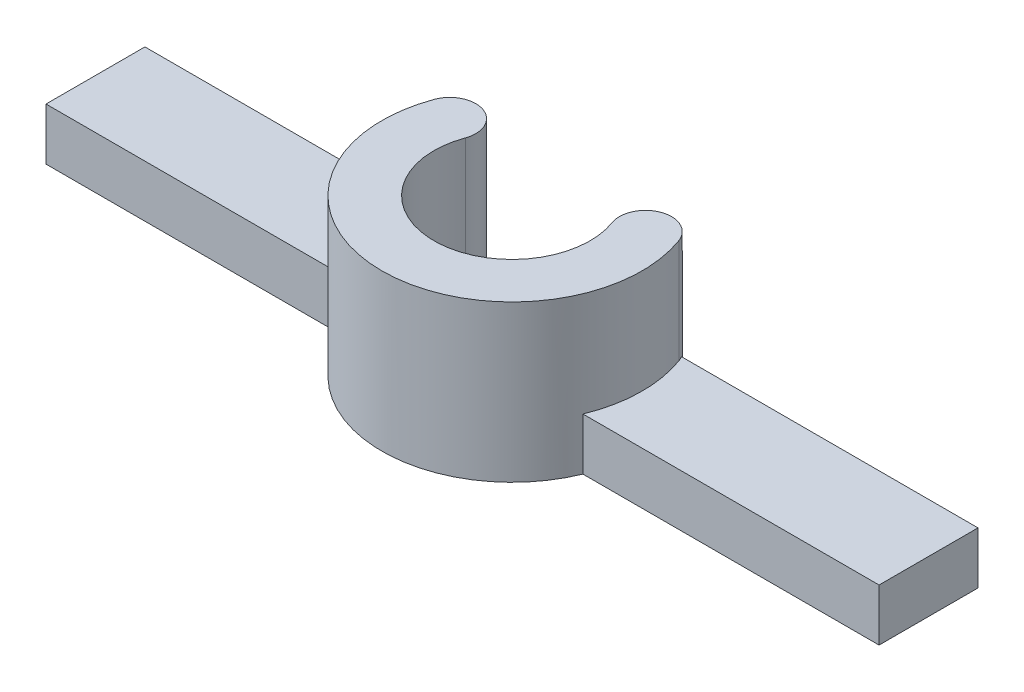
ISO-10303-21;
HEADER;
FILE_DESCRIPTION(('STEP AP214'),'2;1');
FILE_NAME('part.step','',(''),(''),'','','');
FILE_SCHEMA(('AUTOMOTIVE_DESIGN { 1 0 10303 214 1 1 1 1 }'));
ENDSEC;
DATA;
#1=APPLICATION_CONTEXT('core data for automotive mechanical design processes');
#2=APPLICATION_PROTOCOL_DEFINITION('international standard','automotive_design',2000,#1);
#3=PRODUCT_CONTEXT('',#1,'mechanical');
#4=PRODUCT('Part','Part','',(#3));
#5=PRODUCT_RELATED_PRODUCT_CATEGORY('part','',(#4));
#6=PRODUCT_DEFINITION_FORMATION('','',#4);
#7=PRODUCT_DEFINITION_CONTEXT('part definition',#1,'design');
#8=PRODUCT_DEFINITION('design','',#6,#7);
#9=PRODUCT_DEFINITION_SHAPE('','',#8);
#10=(LENGTH_UNIT() NAMED_UNIT(*) SI_UNIT(.MILLI.,.METRE.));
#11=(NAMED_UNIT(*) PLANE_ANGLE_UNIT() SI_UNIT($,.RADIAN.));
#12=(NAMED_UNIT(*) SI_UNIT($,.STERADIAN.) SOLID_ANGLE_UNIT());
#13=UNCERTAINTY_MEASURE_WITH_UNIT(LENGTH_MEASURE(1.E-05),#10,'distance_accuracy_value','');
#14=(GEOMETRIC_REPRESENTATION_CONTEXT(3) GLOBAL_UNCERTAINTY_ASSIGNED_CONTEXT((#13)) GLOBAL_UNIT_ASSIGNED_CONTEXT((#10,
#11,#12)) REPRESENTATION_CONTEXT('',''));
#15=CARTESIAN_POINT('',(0.,0.,0.));
#16=DIRECTION('',(0.,0.,1.));
#17=DIRECTION('',(1.,0.,0.));
#18=AXIS2_PLACEMENT_3D('',#15,#16,#17);
#19=CARTESIAN_POINT('',(3.75877048314363,6.,-1.36808057330268));
#20=DIRECTION('',(0.,-1.,0.));
#21=DIRECTION('',(0.,0.,-1.));
#22=AXIS2_PLACEMENT_3D('',#19,#20,#21);
#23=CYLINDRICAL_SURFACE('',#22,1.);
#24=DIRECTION('',(0.,-1.,0.));
#25=VECTOR('',#24,1.);
#26=CARTESIAN_POINT('',(4.60556545449266,6.,-1.9));
#27=LINE('',#26,#25);
#28=CARTESIAN_POINT('',(4.60556545449266,0.,-1.9));
#29=VERTEX_POINT('',#28);
#30=CARTESIAN_POINT('',(4.60556545449266,2.,-1.9));
#31=VERTEX_POINT('',#30);
#32=EDGE_CURVE('E148',#29,#31,#27,.F.);
#33=ORIENTED_EDGE('',*,*,#32,.F.);
#34=CARTESIAN_POINT('',(3.75877048314363,0.,-1.36808057330268));
#35=DIRECTION('',(0.,1.,0.));
#36=DIRECTION('',(0.,0.,1.));
#37=AXIS2_PLACEMENT_3D('',#34,#35,#36);
#38=CIRCLE('',#37,1.);
#39=CARTESIAN_POINT('',(2.81907786235773,0.,-1.02606042997701));
#40=VERTEX_POINT('',#39);
#41=EDGE_CURVE('E241',#29,#40,#38,.T.);
#42=ORIENTED_EDGE('',*,*,#41,.T.);
#43=DIRECTION('',(0.,-1.,0.));
#44=VECTOR('',#43,1.);
#45=CARTESIAN_POINT('',(2.81907786235773,6.,-1.02606042997701));
#46=LINE('',#45,#44);
#47=CARTESIAN_POINT('',(2.81907786235773,6.,-1.02606042997701));
#48=VERTEX_POINT('',#47);
#49=EDGE_CURVE('E250',#48,#40,#46,.T.);
#50=ORIENTED_EDGE('',*,*,#49,.F.);
#51=CARTESIAN_POINT('',(3.75877048314363,6.,-1.36808057330268));
#52=DIRECTION('',(0.,1.,0.));
#53=DIRECTION('',(0.,0.,1.));
#54=AXIS2_PLACEMENT_3D('',#51,#52,#53);
#55=CIRCLE('',#54,1.);
#56=CARTESIAN_POINT('',(4.69846310392954,6.,-1.71010071662835));
#57=VERTEX_POINT('',#56);
#58=EDGE_CURVE('E228',#57,#48,#55,.T.);
#59=ORIENTED_EDGE('',*,*,#58,.F.);
#60=DIRECTION('',(0.,-1.,0.));
#61=VECTOR('',#60,1.);
#62=CARTESIAN_POINT('',(4.69846310392954,6.,-1.71010071662835));
#63=LINE('',#62,#61);
#64=CARTESIAN_POINT('',(4.69846310392954,2.,-1.71010071662835));
#65=VERTEX_POINT('',#64);
#66=EDGE_CURVE('E254',#57,#65,#63,.T.);
#67=ORIENTED_EDGE('',*,*,#66,.T.);
#68=CARTESIAN_POINT('',(3.75877048314363,2.,-1.36808057330268));
#69=DIRECTION('',(0.,1.,0.));
#70=DIRECTION('',(0.,0.,1.));
#71=AXIS2_PLACEMENT_3D('',#68,#69,#70);
#72=CIRCLE('',#71,1.);
#73=EDGE_CURVE('E11',#65,#31,#72,.T.);
#74=ORIENTED_EDGE('',*,*,#73,.T.);
#75=EDGE_LOOP('',(#33,#42,#50,#59,#67,#74));
#76=FACE_BOUND('',#75,.T.);
#77=ADVANCED_FACE('F41',(#76),#23,.T.);
#78=CARTESIAN_POINT('',(0.,6.,0.));
#79=DIRECTION('',(0.,-1.,0.));
#80=DIRECTION('',(0.,0.,-1.));
#81=AXIS2_PLACEMENT_3D('',#78,#79,#80);
#82=CYLINDRICAL_SURFACE('',#81,5.);
#83=CARTESIAN_POINT('',(0.,0.,0.));
#84=DIRECTION('',(0.,1.,0.));
#85=DIRECTION('',(0.,0.,1.));
#86=AXIS2_PLACEMENT_3D('',#83,#84,#85);
#87=CIRCLE('',#86,5.);
#88=CARTESIAN_POINT('',(-4.62493243193887,0.,1.9));
#89=VERTEX_POINT('',#88);
#90=CARTESIAN_POINT('',(4.62493243193887,0.,1.9));
#91=VERTEX_POINT('',#90);
#92=EDGE_CURVE('E238',#89,#91,#87,.T.);
#93=ORIENTED_EDGE('',*,*,#92,.T.);
#94=DIRECTION('',(0.,-1.,0.));
#95=VECTOR('',#94,1.);
#96=CARTESIAN_POINT('',(4.62493243193887,6.,1.9));
#97=LINE('',#96,#95);
#98=CARTESIAN_POINT('',(4.62493243193887,2.,1.9));
#99=VERTEX_POINT('',#98);
#100=EDGE_CURVE('E57',#91,#99,#97,.F.);
#101=ORIENTED_EDGE('',*,*,#100,.T.);
#102=CARTESIAN_POINT('',(0.,2.,0.));
#103=DIRECTION('',(0.,1.,0.));
#104=DIRECTION('',(0.,0.,1.));
#105=AXIS2_PLACEMENT_3D('',#102,#103,#104);
#106=CIRCLE('',#105,5.);
#107=EDGE_CURVE('E175',#99,#65,#106,.T.);
#108=ORIENTED_EDGE('',*,*,#107,.T.);
#109=ORIENTED_EDGE('',*,*,#66,.F.);
#110=CARTESIAN_POINT('',(0.,6.,0.));
#111=DIRECTION('',(0.,1.,0.));
#112=DIRECTION('',(0.,0.,1.));
#113=AXIS2_PLACEMENT_3D('',#110,#111,#112);
#114=CIRCLE('',#113,5.);
#115=CARTESIAN_POINT('',(-4.69846310392954,6.,-1.71010071662835));
#116=VERTEX_POINT('',#115);
#117=EDGE_CURVE('E224',#116,#57,#114,.T.);
#118=ORIENTED_EDGE('',*,*,#117,.F.);
#119=DIRECTION('',(0.,-1.,0.));
#120=VECTOR('',#119,1.);
#121=CARTESIAN_POINT('',(-4.69846310392954,6.,-1.71010071662835));
#122=LINE('',#121,#120);
#123=CARTESIAN_POINT('',(-4.69846310392954,2.,-1.71010071662835));
#124=VERTEX_POINT('',#123);
#125=EDGE_CURVE('E257',#116,#124,#122,.T.);
#126=ORIENTED_EDGE('',*,*,#125,.T.);
#127=CARTESIAN_POINT('',(0.,2.,0.));
#128=DIRECTION('',(0.,1.,0.));
#129=DIRECTION('',(0.,0.,1.));
#130=AXIS2_PLACEMENT_3D('',#127,#128,#129);
#131=CIRCLE('',#130,5.);
#132=CARTESIAN_POINT('',(-4.62493243193887,2.,1.9));
#133=VERTEX_POINT('',#132);
#134=EDGE_CURVE('E50',#124,#133,#131,.T.);
#135=ORIENTED_EDGE('',*,*,#134,.T.);
#136=DIRECTION('',(0.,-1.,0.));
#137=VECTOR('',#136,1.);
#138=CARTESIAN_POINT('',(-4.62493243193887,6.,1.9));
#139=LINE('',#138,#137);
#140=EDGE_CURVE('E207',#89,#133,#139,.F.);
#141=ORIENTED_EDGE('',*,*,#140,.F.);
#142=EDGE_LOOP('',(#93,#101,#108,#109,#118,#126,#135,#141));
#143=FACE_BOUND('',#142,.T.);
#144=ADVANCED_FACE('F263',(#143),#82,.T.);
#145=CARTESIAN_POINT('',(-3.75877048314363,6.,-1.36808057330268));
#146=DIRECTION('',(0.,-1.,0.));
#147=DIRECTION('',(0.,0.,-1.));
#148=AXIS2_PLACEMENT_3D('',#145,#146,#147);
#149=CYLINDRICAL_SURFACE('',#148,1.);
#150=DIRECTION('',(0.,-1.,0.));
#151=VECTOR('',#150,1.);
#152=CARTESIAN_POINT('',(-4.60556545449266,6.,-1.9));
#153=LINE('',#152,#151);
#154=CARTESIAN_POINT('',(-4.60556545449266,2.,-1.9));
#155=VERTEX_POINT('',#154);
#156=CARTESIAN_POINT('',(-4.60556545449266,0.,-1.9));
#157=VERTEX_POINT('',#156);
#158=EDGE_CURVE('E211',#155,#157,#153,.T.);
#159=ORIENTED_EDGE('',*,*,#158,.F.);
#160=CARTESIAN_POINT('',(-3.75877048314363,2.,-1.36808057330268));
#161=DIRECTION('',(0.,1.,0.));
#162=DIRECTION('',(0.,0.,1.));
#163=AXIS2_PLACEMENT_3D('',#160,#161,#162);
#164=CIRCLE('',#163,1.);
#165=EDGE_CURVE('E215',#124,#155,#164,.F.);
#166=ORIENTED_EDGE('',*,*,#165,.F.);
#167=ORIENTED_EDGE('',*,*,#125,.F.);
#168=CARTESIAN_POINT('',(-3.75877048314363,6.,-1.36808057330268));
#169=DIRECTION('',(0.,1.,0.));
#170=DIRECTION('',(0.,0.,1.));
#171=AXIS2_PLACEMENT_3D('',#168,#169,#170);
#172=CIRCLE('',#171,1.);
#173=CARTESIAN_POINT('',(-2.81907786235773,6.,-1.02606042997701));
#174=VERTEX_POINT('',#173);
#175=EDGE_CURVE('E220',#116,#174,#172,.F.);
#176=ORIENTED_EDGE('',*,*,#175,.T.);
#177=DIRECTION('',(0.,-1.,0.));
#178=VECTOR('',#177,1.);
#179=CARTESIAN_POINT('',(-2.81907786235773,6.,-1.02606042997701));
#180=LINE('',#179,#178);
#181=CARTESIAN_POINT('',(-2.81907786235773,0.,-1.02606042997701));
#182=VERTEX_POINT('',#181);
#183=EDGE_CURVE('E235',#174,#182,#180,.T.);
#184=ORIENTED_EDGE('',*,*,#183,.T.);
#185=CARTESIAN_POINT('',(-3.75877048314363,0.,-1.36808057330268));
#186=DIRECTION('',(0.,1.,0.));
#187=DIRECTION('',(0.,0.,1.));
#188=AXIS2_PLACEMENT_3D('',#185,#186,#187);
#189=CIRCLE('',#188,1.);
#190=EDGE_CURVE('E219',#157,#182,#189,.F.);
#191=ORIENTED_EDGE('',*,*,#190,.F.);
#192=EDGE_LOOP('',(#159,#166,#167,#176,#184,#191));
#193=FACE_BOUND('',#192,.T.);
#194=ADVANCED_FACE('F43',(#193),#149,.T.);
#195=CARTESIAN_POINT('',(0.,6.,0.));
#196=DIRECTION('',(0.,-1.,0.));
#197=DIRECTION('',(0.,0.,-1.));
#198=AXIS2_PLACEMENT_3D('',#195,#196,#197);
#199=CYLINDRICAL_SURFACE('',#198,3.);
#200=CARTESIAN_POINT('',(0.,0.,0.));
#201=DIRECTION('',(0.,1.,0.));
#202=DIRECTION('',(0.,0.,1.));
#203=AXIS2_PLACEMENT_3D('',#200,#201,#202);
#204=CIRCLE('',#203,3.);
#205=EDGE_CURVE('E225',#182,#40,#204,.T.);
#206=ORIENTED_EDGE('',*,*,#205,.F.);
#207=ORIENTED_EDGE('',*,*,#183,.F.);
#208=CARTESIAN_POINT('',(0.,6.,0.));
#209=DIRECTION('',(0.,1.,0.));
#210=DIRECTION('',(0.,0.,1.));
#211=AXIS2_PLACEMENT_3D('',#208,#209,#210);
#212=CIRCLE('',#211,3.);
#213=EDGE_CURVE('E231',#174,#48,#212,.T.);
#214=ORIENTED_EDGE('',*,*,#213,.T.);
#215=ORIENTED_EDGE('',*,*,#49,.T.);
#216=EDGE_LOOP('',(#206,#207,#214,#215));
#217=FACE_BOUND('',#216,.T.);
#218=ADVANCED_FACE('F291',(#217),#199,.F.);
#219=CARTESIAN_POINT('',(0.,6.,0.));
#220=DIRECTION('',(0.,1.,0.));
#221=DIRECTION('',(0.,0.,1.));
#222=AXIS2_PLACEMENT_3D('',#219,#220,#221);
#223=PLANE('',#222);
#224=ORIENTED_EDGE('',*,*,#175,.F.);
#225=ORIENTED_EDGE('',*,*,#117,.T.);
#226=ORIENTED_EDGE('',*,*,#58,.T.);
#227=ORIENTED_EDGE('',*,*,#213,.F.);
#228=EDGE_LOOP('',(#224,#225,#226,#227));
#229=FACE_BOUND('',#228,.T.);
#230=ADVANCED_FACE('F294',(#229),#223,.T.);
#231=CARTESIAN_POINT('',(0.,0.,0.));
#232=DIRECTION('',(0.,1.,0.));
#233=DIRECTION('',(0.,0.,1.));
#234=AXIS2_PLACEMENT_3D('',#231,#232,#233);
#235=PLANE('',#234);
#236=ORIENTED_EDGE('',*,*,#41,.F.);
#237=DIRECTION('',(-1.,0.,0.));
#238=VECTOR('',#237,1.);
#239=CARTESIAN_POINT('',(0.,0.,-1.9));
#240=LINE('',#239,#238);
#241=CARTESIAN_POINT('',(16.,0.,-1.9));
#242=VERTEX_POINT('',#241);
#243=EDGE_CURVE('E160',#242,#29,#240,.T.);
#244=ORIENTED_EDGE('',*,*,#243,.F.);
#245=DIRECTION('',(0.,0.,1.));
#246=VECTOR('',#245,1.);
#247=CARTESIAN_POINT('',(16.,0.,0.));
#248=LINE('',#247,#246);
#249=CARTESIAN_POINT('',(16.,0.,1.9));
#250=VERTEX_POINT('',#249);
#251=EDGE_CURVE('E138',#242,#250,#248,.T.);
#252=ORIENTED_EDGE('',*,*,#251,.T.);
#253=DIRECTION('',(-1.,0.,0.));
#254=VECTOR('',#253,1.);
#255=CARTESIAN_POINT('',(0.,0.,1.9));
#256=LINE('',#255,#254);
#257=EDGE_CURVE('E156',#250,#91,#256,.T.);
#258=ORIENTED_EDGE('',*,*,#257,.T.);
#259=ORIENTED_EDGE('',*,*,#92,.F.);
#260=DIRECTION('',(1.,0.,0.));
#261=VECTOR('',#260,1.);
#262=CARTESIAN_POINT('',(0.,0.,1.9));
#263=LINE('',#262,#261);
#264=CARTESIAN_POINT('',(-16.,0.,1.9));
#265=VERTEX_POINT('',#264);
#266=EDGE_CURVE('E184',#265,#89,#263,.T.);
#267=ORIENTED_EDGE('',*,*,#266,.F.);
#268=DIRECTION('',(0.,0.,1.));
#269=VECTOR('',#268,1.);
#270=CARTESIAN_POINT('',(-16.,0.,0.));
#271=LINE('',#270,#269);
#272=CARTESIAN_POINT('',(-16.,0.,-1.9));
#273=VERTEX_POINT('',#272);
#274=EDGE_CURVE('E195',#273,#265,#271,.T.);
#275=ORIENTED_EDGE('',*,*,#274,.F.);
#276=DIRECTION('',(1.,0.,0.));
#277=VECTOR('',#276,1.);
#278=CARTESIAN_POINT('',(0.,0.,-1.9));
#279=LINE('',#278,#277);
#280=EDGE_CURVE('E178',#273,#157,#279,.T.);
#281=ORIENTED_EDGE('',*,*,#280,.T.);
#282=ORIENTED_EDGE('',*,*,#190,.T.);
#283=ORIENTED_EDGE('',*,*,#205,.T.);
#284=EDGE_LOOP('',(#236,#244,#252,#258,#259,#267,#275,#281,#282,#283));
#285=FACE_BOUND('',#284,.T.);
#286=ADVANCED_FACE('F278',(#285),#235,.F.);
#287=CARTESIAN_POINT('',(0.,2.,0.));
#288=DIRECTION('',(0.,1.,0.));
#289=DIRECTION('',(0.,0.,1.));
#290=AXIS2_PLACEMENT_3D('',#287,#288,#289);
#291=PLANE('',#290);
#292=ORIENTED_EDGE('',*,*,#134,.F.);
#293=ORIENTED_EDGE('',*,*,#165,.T.);
#294=DIRECTION('',(1.,0.,0.));
#295=VECTOR('',#294,1.);
#296=CARTESIAN_POINT('',(0.,2.,-1.9));
#297=LINE('',#296,#295);
#298=CARTESIAN_POINT('',(-16.,2.,-1.9));
#299=VERTEX_POINT('',#298);
#300=EDGE_CURVE('E179',#299,#155,#297,.T.);
#301=ORIENTED_EDGE('',*,*,#300,.F.);
#302=DIRECTION('',(0.,0.,1.));
#303=VECTOR('',#302,1.);
#304=CARTESIAN_POINT('',(-16.,2.,0.));
#305=LINE('',#304,#303);
#306=CARTESIAN_POINT('',(-16.,2.,1.9));
#307=VERTEX_POINT('',#306);
#308=EDGE_CURVE('E183',#299,#307,#305,.T.);
#309=ORIENTED_EDGE('',*,*,#308,.T.);
#310=DIRECTION('',(1.,0.,0.));
#311=VECTOR('',#310,1.);
#312=CARTESIAN_POINT('',(0.,2.,1.9));
#313=LINE('',#312,#311);
#314=EDGE_CURVE('E187',#307,#133,#313,.T.);
#315=ORIENTED_EDGE('',*,*,#314,.T.);
#316=EDGE_LOOP('',(#292,#293,#301,#309,#315));
#317=FACE_BOUND('',#316,.T.);
#318=ADVANCED_FACE('F270',(#317),#291,.T.);
#319=CARTESIAN_POINT('',(0.,2.,1.9));
#320=DIRECTION('',(0.,0.,-1.));
#321=DIRECTION('',(-1.,0.,0.));
#322=AXIS2_PLACEMENT_3D('',#319,#320,#321);
#323=PLANE('',#322);
#324=ORIENTED_EDGE('',*,*,#266,.T.);
#325=ORIENTED_EDGE('',*,*,#140,.T.);
#326=ORIENTED_EDGE('',*,*,#314,.F.);
#327=DIRECTION('',(0.,-1.,0.));
#328=VECTOR('',#327,1.);
#329=CARTESIAN_POINT('',(-16.,2.,1.9));
#330=LINE('',#329,#328);
#331=EDGE_CURVE('E191',#307,#265,#330,.T.);
#332=ORIENTED_EDGE('',*,*,#331,.T.);
#333=EDGE_LOOP('',(#324,#325,#326,#332));
#334=FACE_BOUND('',#333,.T.);
#335=ADVANCED_FACE('F268',(#334),#323,.F.);
#336=CARTESIAN_POINT('',(0.,2.,-1.9));
#337=DIRECTION('',(0.,0.,-1.));
#338=DIRECTION('',(-1.,0.,0.));
#339=AXIS2_PLACEMENT_3D('',#336,#337,#338);
#340=PLANE('',#339);
#341=ORIENTED_EDGE('',*,*,#300,.T.);
#342=ORIENTED_EDGE('',*,*,#158,.T.);
#343=ORIENTED_EDGE('',*,*,#280,.F.);
#344=DIRECTION('',(0.,-1.,0.));
#345=VECTOR('',#344,1.);
#346=CARTESIAN_POINT('',(-16.,2.,-1.9));
#347=LINE('',#346,#345);
#348=EDGE_CURVE('E204',#299,#273,#347,.T.);
#349=ORIENTED_EDGE('',*,*,#348,.F.);
#350=EDGE_LOOP('',(#341,#342,#343,#349));
#351=FACE_BOUND('',#350,.T.);
#352=ADVANCED_FACE('F301',(#351),#340,.T.);
#353=CARTESIAN_POINT('',(-16.,2.,0.));
#354=DIRECTION('',(1.,0.,0.));
#355=DIRECTION('',(0.,0.,-1.));
#356=AXIS2_PLACEMENT_3D('',#353,#354,#355);
#357=PLANE('',#356);
#358=ORIENTED_EDGE('',*,*,#274,.T.);
#359=ORIENTED_EDGE('',*,*,#331,.F.);
#360=ORIENTED_EDGE('',*,*,#308,.F.);
#361=ORIENTED_EDGE('',*,*,#348,.T.);
#362=EDGE_LOOP('',(#358,#359,#360,#361));
#363=FACE_BOUND('',#362,.T.);
#364=ADVANCED_FACE('F275',(#363),#357,.F.);
#365=CARTESIAN_POINT('',(0.,2.,-1.9));
#366=DIRECTION('',(0.,0.,1.));
#367=DIRECTION('',(1.,0.,0.));
#368=AXIS2_PLACEMENT_3D('',#365,#366,#367);
#369=PLANE('',#368);
#370=ORIENTED_EDGE('',*,*,#243,.T.);
#371=ORIENTED_EDGE('',*,*,#32,.T.);
#372=DIRECTION('',(-1.,0.,0.));
#373=VECTOR('',#372,1.);
#374=CARTESIAN_POINT('',(0.,2.,-1.9));
#375=LINE('',#374,#373);
#376=CARTESIAN_POINT('',(16.,2.,-1.9));
#377=VERTEX_POINT('',#376);
#378=EDGE_CURVE('E146',#377,#31,#375,.T.);
#379=ORIENTED_EDGE('',*,*,#378,.F.);
#380=DIRECTION('',(0.,-1.,0.));
#381=VECTOR('',#380,1.);
#382=CARTESIAN_POINT('',(16.,2.,-1.9));
#383=LINE('',#382,#381);
#384=EDGE_CURVE('E131',#377,#242,#383,.T.);
#385=ORIENTED_EDGE('',*,*,#384,.T.);
#386=EDGE_LOOP('',(#370,#371,#379,#385));
#387=FACE_BOUND('',#386,.T.);
#388=ADVANCED_FACE('F147',(#387),#369,.F.);
#389=CARTESIAN_POINT('',(0.,2.,1.9));
#390=DIRECTION('',(0.,0.,1.));
#391=DIRECTION('',(1.,0.,0.));
#392=AXIS2_PLACEMENT_3D('',#389,#390,#391);
#393=PLANE('',#392);
#394=ORIENTED_EDGE('',*,*,#100,.F.);
#395=ORIENTED_EDGE('',*,*,#257,.F.);
#396=DIRECTION('',(0.,-1.,0.));
#397=VECTOR('',#396,1.);
#398=CARTESIAN_POINT('',(16.,2.,1.9));
#399=LINE('',#398,#397);
#400=CARTESIAN_POINT('',(16.,2.,1.9));
#401=VERTEX_POINT('',#400);
#402=EDGE_CURVE('E143',#401,#250,#399,.T.);
#403=ORIENTED_EDGE('',*,*,#402,.F.);
#404=DIRECTION('',(-1.,0.,0.));
#405=VECTOR('',#404,1.);
#406=CARTESIAN_POINT('',(0.,2.,1.9));
#407=LINE('',#406,#405);
#408=EDGE_CURVE('E151',#401,#99,#407,.T.);
#409=ORIENTED_EDGE('',*,*,#408,.T.);
#410=EDGE_LOOP('',(#394,#395,#403,#409));
#411=FACE_BOUND('',#410,.T.);
#412=ADVANCED_FACE('F282',(#411),#393,.T.);
#413=CARTESIAN_POINT('',(16.,2.,0.));
#414=DIRECTION('',(1.,0.,0.));
#415=DIRECTION('',(0.,0.,-1.));
#416=AXIS2_PLACEMENT_3D('',#413,#414,#415);
#417=PLANE('',#416);
#418=ORIENTED_EDGE('',*,*,#251,.F.);
#419=ORIENTED_EDGE('',*,*,#384,.F.);
#420=DIRECTION('',(0.,0.,1.));
#421=VECTOR('',#420,1.);
#422=CARTESIAN_POINT('',(16.,2.,0.));
#423=LINE('',#422,#421);
#424=EDGE_CURVE('E135',#377,#401,#423,.T.);
#425=ORIENTED_EDGE('',*,*,#424,.T.);
#426=ORIENTED_EDGE('',*,*,#402,.T.);
#427=EDGE_LOOP('',(#418,#419,#425,#426));
#428=FACE_BOUND('',#427,.T.);
#429=ADVANCED_FACE('F133',(#428),#417,.T.);
#430=CARTESIAN_POINT('',(0.,2.,0.));
#431=DIRECTION('',(0.,1.,0.));
#432=DIRECTION('',(0.,0.,1.));
#433=AXIS2_PLACEMENT_3D('',#430,#431,#432);
#434=PLANE('',#433);
#435=ORIENTED_EDGE('',*,*,#107,.F.);
#436=ORIENTED_EDGE('',*,*,#408,.F.);
#437=ORIENTED_EDGE('',*,*,#424,.F.);
#438=ORIENTED_EDGE('',*,*,#378,.T.);
#439=ORIENTED_EDGE('',*,*,#73,.F.);
#440=EDGE_LOOP('',(#435,#436,#437,#438,#439));
#441=FACE_BOUND('',#440,.T.);
#442=ADVANCED_FACE('F153',(#441),#434,.T.);
#443=CLOSED_SHELL('',(#77,#144,#194,#218,#230,#286,#318,#335,#352,#364,#388,#412,#429,#442));
#444=MANIFOLD_SOLID_BREP('B2',#443);
#445=ADVANCED_BREP_SHAPE_REPRESENTATION('',(#18,#444),#14);
#446=SHAPE_DEFINITION_REPRESENTATION(#9,#445);
ENDSEC;
END-ISO-10303-21;
